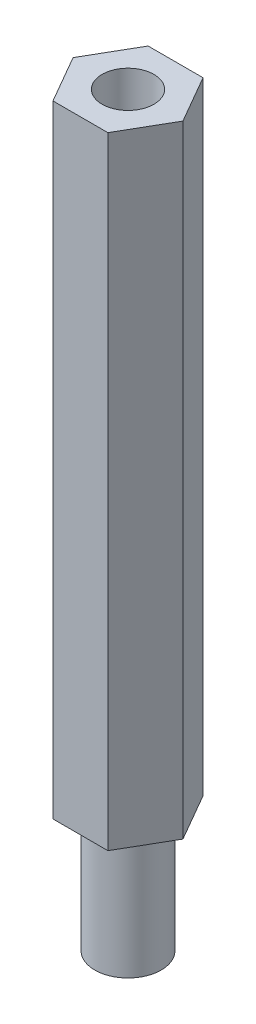
ISO-10303-21;
HEADER;
FILE_DESCRIPTION(('STEP AP214'),'2;1');
FILE_NAME('part.step','',(''),(''),'','','');
FILE_SCHEMA(('AUTOMOTIVE_DESIGN { 1 0 10303 214 1 1 1 1 }'));
ENDSEC;
DATA;
#1=APPLICATION_CONTEXT('core data for automotive mechanical design processes');
#2=APPLICATION_PROTOCOL_DEFINITION('international standard','automotive_design',2000,#1);
#3=PRODUCT_CONTEXT('',#1,'mechanical');
#4=PRODUCT('Part','Part','',(#3));
#5=PRODUCT_RELATED_PRODUCT_CATEGORY('part','',(#4));
#6=PRODUCT_DEFINITION_FORMATION('','',#4);
#7=PRODUCT_DEFINITION_CONTEXT('part definition',#1,'design');
#8=PRODUCT_DEFINITION('design','',#6,#7);
#9=PRODUCT_DEFINITION_SHAPE('','',#8);
#10=(LENGTH_UNIT() NAMED_UNIT(*) SI_UNIT(.MILLI.,.METRE.));
#11=(NAMED_UNIT(*) PLANE_ANGLE_UNIT() SI_UNIT($,.RADIAN.));
#12=(NAMED_UNIT(*) SI_UNIT($,.STERADIAN.) SOLID_ANGLE_UNIT());
#13=UNCERTAINTY_MEASURE_WITH_UNIT(LENGTH_MEASURE(1.E-05),#10,'distance_accuracy_value','');
#14=(GEOMETRIC_REPRESENTATION_CONTEXT(3) GLOBAL_UNCERTAINTY_ASSIGNED_CONTEXT((#13)) GLOBAL_UNIT_ASSIGNED_CONTEXT((#10,
#11,#12)) REPRESENTATION_CONTEXT('',''));
#15=CARTESIAN_POINT('',(0.,0.,0.));
#16=DIRECTION('',(0.,0.,1.));
#17=DIRECTION('',(1.,0.,0.));
#18=AXIS2_PLACEMENT_3D('',#15,#16,#17);
#19=CARTESIAN_POINT('',(-1.325,30.,2.29496732002876));
#20=DIRECTION('',(0.,0.,-1.));
#21=DIRECTION('',(-1.,0.,0.));
#22=AXIS2_PLACEMENT_3D('',#19,#20,#21);
#23=PLANE('',#22);
#24=DIRECTION('',(1.,0.,0.));
#25=VECTOR('',#24,1.);
#26=CARTESIAN_POINT('',(-1.325,0.,2.29496732002876));
#27=LINE('',#26,#25);
#28=CARTESIAN_POINT('',(-1.325,0.,2.29496732002876));
#29=VERTEX_POINT('',#28);
#30=CARTESIAN_POINT('',(1.325,0.,2.29496732002876));
#31=VERTEX_POINT('',#30);
#32=EDGE_CURVE('E122',#29,#31,#27,.T.);
#33=ORIENTED_EDGE('',*,*,#32,.T.);
#34=DIRECTION('',(0.,-1.,0.));
#35=VECTOR('',#34,1.);
#36=CARTESIAN_POINT('',(1.325,30.,2.29496732002876));
#37=LINE('',#36,#35);
#38=CARTESIAN_POINT('',(1.325,30.,2.29496732002876));
#39=VERTEX_POINT('',#38);
#40=EDGE_CURVE('E45',#39,#31,#37,.T.);
#41=ORIENTED_EDGE('',*,*,#40,.F.);
#42=DIRECTION('',(1.,0.,0.));
#43=VECTOR('',#42,1.);
#44=CARTESIAN_POINT('',(-1.325,30.,2.29496732002876));
#45=LINE('',#44,#43);
#46=CARTESIAN_POINT('',(-1.325,30.,2.29496732002876));
#47=VERTEX_POINT('',#46);
#48=EDGE_CURVE('E133',#47,#39,#45,.T.);
#49=ORIENTED_EDGE('',*,*,#48,.F.);
#50=DIRECTION('',(0.,-1.,0.));
#51=VECTOR('',#50,1.);
#52=CARTESIAN_POINT('',(-1.325,30.,2.29496732002876));
#53=LINE('',#52,#51);
#54=EDGE_CURVE('E118',#47,#29,#53,.T.);
#55=ORIENTED_EDGE('',*,*,#54,.T.);
#56=EDGE_LOOP('',(#33,#41,#49,#55));
#57=FACE_BOUND('',#56,.T.);
#58=ADVANCED_FACE('F37',(#57),#23,.F.);
#59=CARTESIAN_POINT('',(1.325,30.,2.29496732002876));
#60=DIRECTION('',(-0.866025403784439,0.,-0.5));
#61=DIRECTION('',(-0.5,0.,0.866025403784439));
#62=AXIS2_PLACEMENT_3D('',#59,#60,#61);
#63=PLANE('',#62);
#64=DIRECTION('',(0.5,0.,-0.866025403784439));
#65=VECTOR('',#64,1.);
#66=CARTESIAN_POINT('',(1.325,0.,2.29496732002876));
#67=LINE('',#66,#65);
#68=CARTESIAN_POINT('',(2.65,0.,0.));
#69=VERTEX_POINT('',#68);
#70=EDGE_CURVE('E125',#31,#69,#67,.T.);
#71=ORIENTED_EDGE('',*,*,#70,.T.);
#72=DIRECTION('',(0.,-1.,0.));
#73=VECTOR('',#72,1.);
#74=CARTESIAN_POINT('',(2.65,30.,0.));
#75=LINE('',#74,#73);
#76=CARTESIAN_POINT('',(2.65,30.,0.));
#77=VERTEX_POINT('',#76);
#78=EDGE_CURVE('E137',#77,#69,#75,.T.);
#79=ORIENTED_EDGE('',*,*,#78,.F.);
#80=DIRECTION('',(0.5,0.,-0.866025403784439));
#81=VECTOR('',#80,1.);
#82=CARTESIAN_POINT('',(1.325,30.,2.29496732002876));
#83=LINE('',#82,#81);
#84=EDGE_CURVE('E91',#39,#77,#83,.T.);
#85=ORIENTED_EDGE('',*,*,#84,.F.);
#86=ORIENTED_EDGE('',*,*,#40,.T.);
#87=EDGE_LOOP('',(#71,#79,#85,#86));
#88=FACE_BOUND('',#87,.T.);
#89=ADVANCED_FACE('F140',(#88),#63,.F.);
#90=CARTESIAN_POINT('',(2.65,30.,0.));
#91=DIRECTION('',(-0.866025403784439,0.,0.5));
#92=DIRECTION('',(0.5,0.,0.866025403784439));
#93=AXIS2_PLACEMENT_3D('',#90,#91,#92);
#94=PLANE('',#93);
#95=DIRECTION('',(-0.5,0.,-0.866025403784439));
#96=VECTOR('',#95,1.);
#97=CARTESIAN_POINT('',(2.65,0.,0.));
#98=LINE('',#97,#96);
#99=CARTESIAN_POINT('',(1.325,0.,-2.29496732002876));
#100=VERTEX_POINT('',#99);
#101=EDGE_CURVE('E128',#69,#100,#98,.T.);
#102=ORIENTED_EDGE('',*,*,#101,.T.);
#103=DIRECTION('',(0.,-1.,0.));
#104=VECTOR('',#103,1.);
#105=CARTESIAN_POINT('',(1.325,30.,-2.29496732002876));
#106=LINE('',#105,#104);
#107=CARTESIAN_POINT('',(1.325,30.,-2.29496732002876));
#108=VERTEX_POINT('',#107);
#109=EDGE_CURVE('E113',#108,#100,#106,.T.);
#110=ORIENTED_EDGE('',*,*,#109,.F.);
#111=DIRECTION('',(-0.5,0.,-0.866025403784439));
#112=VECTOR('',#111,1.);
#113=CARTESIAN_POINT('',(2.65,30.,0.));
#114=LINE('',#113,#112);
#115=EDGE_CURVE('E104',#77,#108,#114,.T.);
#116=ORIENTED_EDGE('',*,*,#115,.F.);
#117=ORIENTED_EDGE('',*,*,#78,.T.);
#118=EDGE_LOOP('',(#102,#110,#116,#117));
#119=FACE_BOUND('',#118,.T.);
#120=ADVANCED_FACE('F148',(#119),#94,.F.);
#121=CARTESIAN_POINT('',(1.325,30.,-2.29496732002876));
#122=DIRECTION('',(0.,0.,1.));
#123=DIRECTION('',(1.,0.,0.));
#124=AXIS2_PLACEMENT_3D('',#121,#122,#123);
#125=PLANE('',#124);
#126=DIRECTION('',(-1.,0.,0.));
#127=VECTOR('',#126,1.);
#128=CARTESIAN_POINT('',(1.325,0.,-2.29496732002876));
#129=LINE('',#128,#127);
#130=CARTESIAN_POINT('',(-1.325,0.,-2.29496732002876));
#131=VERTEX_POINT('',#130);
#132=EDGE_CURVE('E112',#100,#131,#129,.T.);
#133=ORIENTED_EDGE('',*,*,#132,.T.);
#134=DIRECTION('',(0.,-1.,0.));
#135=VECTOR('',#134,1.);
#136=CARTESIAN_POINT('',(-1.325,30.,-2.29496732002876));
#137=LINE('',#136,#135);
#138=CARTESIAN_POINT('',(-1.325,30.,-2.29496732002876));
#139=VERTEX_POINT('',#138);
#140=EDGE_CURVE('E109',#139,#131,#137,.T.);
#141=ORIENTED_EDGE('',*,*,#140,.F.);
#142=DIRECTION('',(-1.,0.,0.));
#143=VECTOR('',#142,1.);
#144=CARTESIAN_POINT('',(1.325,30.,-2.29496732002876));
#145=LINE('',#144,#143);
#146=EDGE_CURVE('E98',#108,#139,#145,.T.);
#147=ORIENTED_EDGE('',*,*,#146,.F.);
#148=ORIENTED_EDGE('',*,*,#109,.T.);
#149=EDGE_LOOP('',(#133,#141,#147,#148));
#150=FACE_BOUND('',#149,.T.);
#151=ADVANCED_FACE('F110',(#150),#125,.F.);
#152=CARTESIAN_POINT('',(-1.325,30.,-2.29496732002876));
#153=DIRECTION('',(0.866025403784439,0.,0.5));
#154=DIRECTION('',(0.5,0.,-0.866025403784439));
#155=AXIS2_PLACEMENT_3D('',#152,#153,#154);
#156=PLANE('',#155);
#157=DIRECTION('',(-0.5,0.,0.866025403784439));
#158=VECTOR('',#157,1.);
#159=CARTESIAN_POINT('',(-1.325,0.,-2.29496732002876));
#160=LINE('',#159,#158);
#161=CARTESIAN_POINT('',(-2.65,0.,0.));
#162=VERTEX_POINT('',#161);
#163=EDGE_CURVE('E76',#131,#162,#160,.T.);
#164=ORIENTED_EDGE('',*,*,#163,.T.);
#165=DIRECTION('',(0.,-1.,0.));
#166=VECTOR('',#165,1.);
#167=CARTESIAN_POINT('',(-2.65,30.,0.));
#168=LINE('',#167,#166);
#169=CARTESIAN_POINT('',(-2.65,30.,0.));
#170=VERTEX_POINT('',#169);
#171=EDGE_CURVE('E114',#170,#162,#168,.T.);
#172=ORIENTED_EDGE('',*,*,#171,.F.);
#173=DIRECTION('',(-0.5,0.,0.866025403784439));
#174=VECTOR('',#173,1.);
#175=CARTESIAN_POINT('',(-1.325,30.,-2.29496732002876));
#176=LINE('',#175,#174);
#177=EDGE_CURVE('E102',#139,#170,#176,.T.);
#178=ORIENTED_EDGE('',*,*,#177,.F.);
#179=ORIENTED_EDGE('',*,*,#140,.T.);
#180=EDGE_LOOP('',(#164,#172,#178,#179));
#181=FACE_BOUND('',#180,.T.);
#182=ADVANCED_FACE('F116',(#181),#156,.F.);
#183=CARTESIAN_POINT('',(-2.65,30.,0.));
#184=DIRECTION('',(0.866025403784439,0.,-0.5));
#185=DIRECTION('',(-0.5,0.,-0.866025403784439));
#186=AXIS2_PLACEMENT_3D('',#183,#184,#185);
#187=PLANE('',#186);
#188=DIRECTION('',(0.5,0.,0.866025403784439));
#189=VECTOR('',#188,1.);
#190=CARTESIAN_POINT('',(-2.65,0.,0.));
#191=LINE('',#190,#189);
#192=EDGE_CURVE('E82',#162,#29,#191,.T.);
#193=ORIENTED_EDGE('',*,*,#192,.T.);
#194=ORIENTED_EDGE('',*,*,#54,.F.);
#195=DIRECTION('',(0.5,0.,0.866025403784439));
#196=VECTOR('',#195,1.);
#197=CARTESIAN_POINT('',(-2.65,30.,0.));
#198=LINE('',#197,#196);
#199=EDGE_CURVE('E53',#170,#47,#198,.T.);
#200=ORIENTED_EDGE('',*,*,#199,.F.);
#201=ORIENTED_EDGE('',*,*,#171,.T.);
#202=EDGE_LOOP('',(#193,#194,#200,#201));
#203=FACE_BOUND('',#202,.T.);
#204=ADVANCED_FACE('F171',(#203),#187,.F.);
#205=CARTESIAN_POINT('',(0.,30.,0.));
#206=DIRECTION('',(0.,1.,0.));
#207=DIRECTION('',(0.,0.,1.));
#208=AXIS2_PLACEMENT_3D('',#205,#206,#207);
#209=PLANE('',#208);
#210=CARTESIAN_POINT('',(0.,30.,0.));
#211=DIRECTION('',(0.,1.,0.));
#212=DIRECTION('',(0.,0.,1.));
#213=AXIS2_PLACEMENT_3D('',#210,#211,#212);
#214=CIRCLE('',#213,1.25);
#215=CARTESIAN_POINT('',(0.,30.,1.25));
#216=VERTEX_POINT('',#215);
#217=EDGE_CURVE('E155',#216,#216,#214,.T.);
#218=ORIENTED_EDGE('',*,*,#217,.F.);
#219=EDGE_LOOP('',(#218));
#220=FACE_BOUND('',#219,.T.);
#221=ORIENTED_EDGE('',*,*,#48,.T.);
#222=ORIENTED_EDGE('',*,*,#84,.T.);
#223=ORIENTED_EDGE('',*,*,#115,.T.);
#224=ORIENTED_EDGE('',*,*,#146,.T.);
#225=ORIENTED_EDGE('',*,*,#177,.T.);
#226=ORIENTED_EDGE('',*,*,#199,.T.);
#227=EDGE_LOOP('',(#221,#222,#223,#224,#225,#226));
#228=FACE_BOUND('',#227,.T.);
#229=ADVANCED_FACE('F100',(#220,#228),#209,.T.);
#230=CARTESIAN_POINT('',(0.,0.,0.));
#231=DIRECTION('',(0.,1.,0.));
#232=DIRECTION('',(0.,0.,1.));
#233=AXIS2_PLACEMENT_3D('',#230,#231,#232);
#234=PLANE('',#233);
#235=CARTESIAN_POINT('',(0.,0.,0.));
#236=DIRECTION('',(0.,1.,0.));
#237=DIRECTION('',(0.,0.,1.));
#238=AXIS2_PLACEMENT_3D('',#235,#236,#237);
#239=CIRCLE('',#238,1.6);
#240=CARTESIAN_POINT('',(0.,0.,1.6));
#241=VERTEX_POINT('',#240);
#242=EDGE_CURVE('E11',#241,#241,#239,.F.);
#243=ORIENTED_EDGE('',*,*,#242,.F.);
#244=EDGE_LOOP('',(#243));
#245=FACE_BOUND('',#244,.T.);
#246=ORIENTED_EDGE('',*,*,#32,.F.);
#247=ORIENTED_EDGE('',*,*,#192,.F.);
#248=ORIENTED_EDGE('',*,*,#163,.F.);
#249=ORIENTED_EDGE('',*,*,#132,.F.);
#250=ORIENTED_EDGE('',*,*,#101,.F.);
#251=ORIENTED_EDGE('',*,*,#70,.F.);
#252=EDGE_LOOP('',(#246,#247,#248,#249,#250,#251));
#253=FACE_BOUND('',#252,.T.);
#254=ADVANCED_FACE('F145',(#245,#253),#234,.F.);
#255=CARTESIAN_POINT('',(0.,-6.,0.));
#256=DIRECTION('',(0.,1.,0.));
#257=DIRECTION('',(0.,0.,1.));
#258=AXIS2_PLACEMENT_3D('',#255,#256,#257);
#259=CYLINDRICAL_SURFACE('',#258,1.6);
#260=CARTESIAN_POINT('',(0.,-6.,0.));
#261=DIRECTION('',(0.,-1.,0.));
#262=DIRECTION('',(0.,0.,-1.));
#263=AXIS2_PLACEMENT_3D('',#260,#261,#262);
#264=CIRCLE('',#263,1.6);
#265=CARTESIAN_POINT('',(0.,-6.,-1.6));
#266=VERTEX_POINT('',#265);
#267=EDGE_CURVE('E126',#266,#266,#264,.T.);
#268=ORIENTED_EDGE('',*,*,#267,.F.);
#269=EDGE_LOOP('',(#268));
#270=FACE_BOUND('',#269,.T.);
#271=ORIENTED_EDGE('',*,*,#242,.T.);
#272=EDGE_LOOP('',(#271));
#273=FACE_BOUND('',#272,.T.);
#274=ADVANCED_FACE('F177',(#270,#273),#259,.T.);
#275=CARTESIAN_POINT('',(0.,-6.,0.));
#276=DIRECTION('',(0.,-1.,0.));
#277=DIRECTION('',(0.,0.,-1.));
#278=AXIS2_PLACEMENT_3D('',#275,#276,#277);
#279=PLANE('',#278);
#280=ORIENTED_EDGE('',*,*,#267,.T.);
#281=EDGE_LOOP('',(#280));
#282=FACE_BOUND('',#281,.T.);
#283=ADVANCED_FACE('F166',(#282),#279,.T.);
#284=CARTESIAN_POINT('',(0.,25.,0.));
#285=DIRECTION('',(0.,1.,0.));
#286=DIRECTION('',(0.,0.,1.));
#287=AXIS2_PLACEMENT_3D('',#284,#285,#286);
#288=CYLINDRICAL_SURFACE('',#287,1.25);
#289=CARTESIAN_POINT('',(0.,25.,0.));
#290=DIRECTION('',(0.,1.,0.));
#291=DIRECTION('',(0.,0.,1.));
#292=AXIS2_PLACEMENT_3D('',#289,#290,#291);
#293=CIRCLE('',#292,1.25);
#294=CARTESIAN_POINT('',(0.,25.,1.25));
#295=VERTEX_POINT('',#294);
#296=EDGE_CURVE('E154',#295,#295,#293,.T.);
#297=ORIENTED_EDGE('',*,*,#296,.F.);
#298=EDGE_LOOP('',(#297));
#299=FACE_BOUND('',#298,.T.);
#300=ORIENTED_EDGE('',*,*,#217,.T.);
#301=EDGE_LOOP('',(#300));
#302=FACE_BOUND('',#301,.T.);
#303=ADVANCED_FACE('F163',(#299,#302),#288,.F.);
#304=CARTESIAN_POINT('',(0.,25.,0.));
#305=DIRECTION('',(0.,1.,0.));
#306=DIRECTION('',(0.,0.,1.));
#307=AXIS2_PLACEMENT_3D('',#304,#305,#306);
#308=PLANE('',#307);
#309=ORIENTED_EDGE('',*,*,#296,.T.);
#310=EDGE_LOOP('',(#309));
#311=FACE_BOUND('',#310,.T.);
#312=ADVANCED_FACE('F161',(#311),#308,.T.);
#313=CLOSED_SHELL('',(#58,#89,#120,#151,#182,#204,#229,#254,#274,#283,#303,#312));
#314=MANIFOLD_SOLID_BREP('B2',#313);
#315=ADVANCED_BREP_SHAPE_REPRESENTATION('',(#18,#314),#14);
#316=SHAPE_DEFINITION_REPRESENTATION(#9,#315);
ENDSEC;
END-ISO-10303-21;
